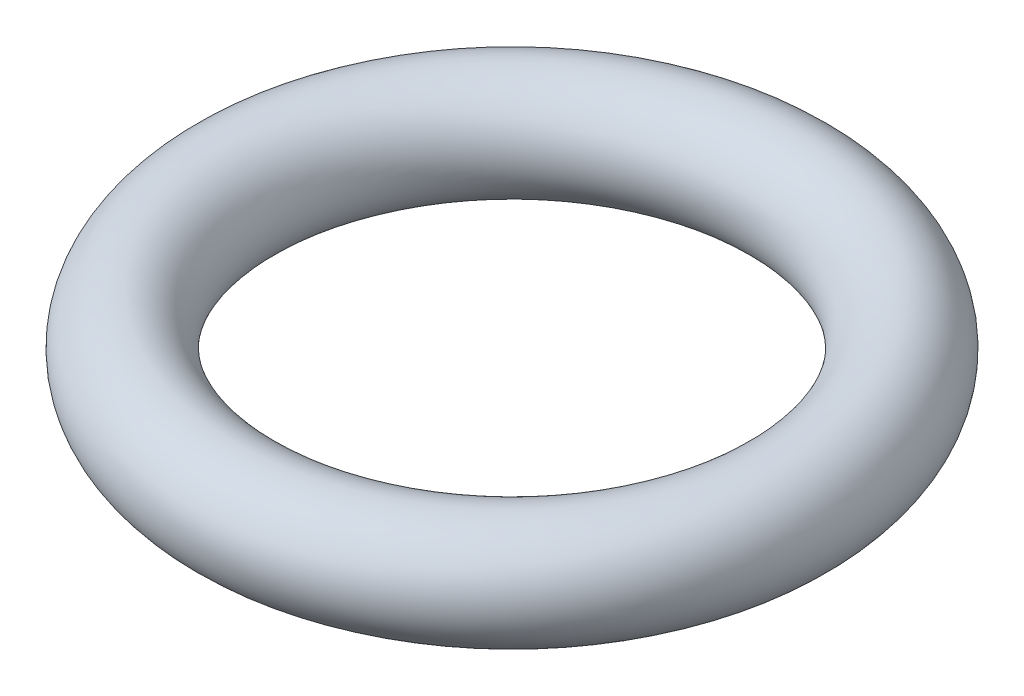
ISO-10303-21;
HEADER;
FILE_DESCRIPTION(('STEP AP214'),'2;1');
FILE_NAME('part.step','',(''),(''),'','','');
FILE_SCHEMA(('AUTOMOTIVE_DESIGN { 1 0 10303 214 1 1 1 1 }'));
ENDSEC;
DATA;
#1=APPLICATION_CONTEXT('core data for automotive mechanical design processes');
#2=APPLICATION_PROTOCOL_DEFINITION('international standard','automotive_design',2000,#1);
#3=PRODUCT_CONTEXT('',#1,'mechanical');
#4=PRODUCT('Part','Part','',(#3));
#5=PRODUCT_RELATED_PRODUCT_CATEGORY('part','',(#4));
#6=PRODUCT_DEFINITION_FORMATION('','',#4);
#7=PRODUCT_DEFINITION_CONTEXT('part definition',#1,'design');
#8=PRODUCT_DEFINITION('design','',#6,#7);
#9=PRODUCT_DEFINITION_SHAPE('','',#8);
#10=(LENGTH_UNIT() NAMED_UNIT(*) SI_UNIT(.MILLI.,.METRE.));
#11=(NAMED_UNIT(*) PLANE_ANGLE_UNIT() SI_UNIT($,.RADIAN.));
#12=(NAMED_UNIT(*) SI_UNIT($,.STERADIAN.) SOLID_ANGLE_UNIT());
#13=UNCERTAINTY_MEASURE_WITH_UNIT(LENGTH_MEASURE(1.E-05),#10,'distance_accuracy_value','');
#14=(GEOMETRIC_REPRESENTATION_CONTEXT(3) GLOBAL_UNCERTAINTY_ASSIGNED_CONTEXT((#13)) GLOBAL_UNIT_ASSIGNED_CONTEXT((#10,
#11,#12)) REPRESENTATION_CONTEXT('',''));
#15=CARTESIAN_POINT('',(0.,0.,0.));
#16=DIRECTION('',(0.,0.,1.));
#17=DIRECTION('',(1.,0.,0.));
#18=AXIS2_PLACEMENT_3D('',#15,#16,#17);
#19=CARTESIAN_POINT('',(0.,0.,0.));
#20=DIRECTION('',(0.,1.,0.));
#21=DIRECTION('',(0.,0.,1.));
#22=AXIS2_PLACEMENT_3D('',#19,#20,#21);
#23=TOROIDAL_SURFACE('',#22,6.7,1.31);
#24=CARTESIAN_POINT('',(0.,0.,8.01));
#25=VERTEX_POINT('',#24);
#26=VERTEX_LOOP('',#25);
#27=FACE_BOUND('',#26,.T.);
#28=ADVANCED_FACE('F28',(#27),#23,.T.);
#29=CLOSED_SHELL('',(#28));
#30=MANIFOLD_SOLID_BREP('B2',#29);
#31=ADVANCED_BREP_SHAPE_REPRESENTATION('',(#18,#30),#14);
#32=SHAPE_DEFINITION_REPRESENTATION(#9,#31);
ENDSEC;
END-ISO-10303-21;
